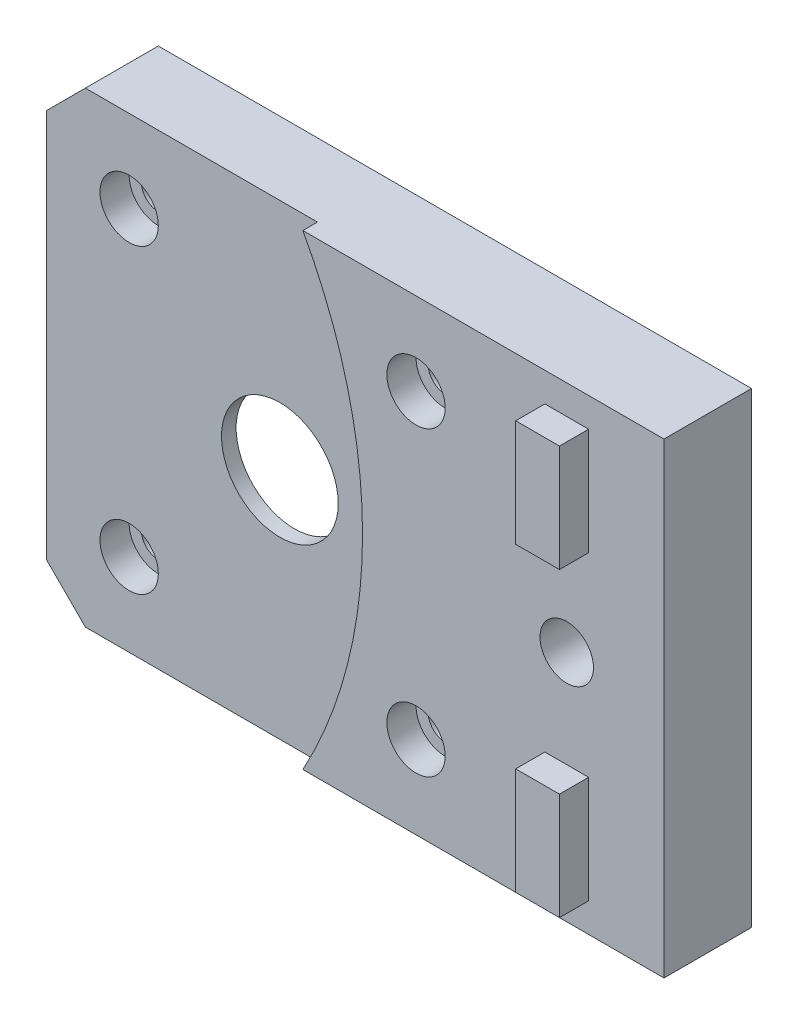
ISO-10303-21;
HEADER;
FILE_DESCRIPTION(('STEP AP214'),'2;1');
FILE_NAME('part.step','',(''),(''),'','','');
FILE_SCHEMA(('AUTOMOTIVE_DESIGN { 1 0 10303 214 1 1 1 1 }'));
ENDSEC;
DATA;
#1=APPLICATION_CONTEXT('core data for automotive mechanical design processes');
#2=APPLICATION_PROTOCOL_DEFINITION('international standard','automotive_design',2000,#1);
#3=PRODUCT_CONTEXT('',#1,'mechanical');
#4=PRODUCT('Part','Part','',(#3));
#5=PRODUCT_RELATED_PRODUCT_CATEGORY('part','',(#4));
#6=PRODUCT_DEFINITION_FORMATION('','',#4);
#7=PRODUCT_DEFINITION_CONTEXT('part definition',#1,'design');
#8=PRODUCT_DEFINITION('design','',#6,#7);
#9=PRODUCT_DEFINITION_SHAPE('','',#8);
#10=(LENGTH_UNIT() NAMED_UNIT(*) SI_UNIT(.MILLI.,.METRE.));
#11=(NAMED_UNIT(*) PLANE_ANGLE_UNIT() SI_UNIT($,.RADIAN.));
#12=(NAMED_UNIT(*) SI_UNIT($,.STERADIAN.) SOLID_ANGLE_UNIT());
#13=UNCERTAINTY_MEASURE_WITH_UNIT(LENGTH_MEASURE(1.E-05),#10,'distance_accuracy_value','');
#14=(GEOMETRIC_REPRESENTATION_CONTEXT(3) GLOBAL_UNCERTAINTY_ASSIGNED_CONTEXT((#13)) GLOBAL_UNIT_ASSIGNED_CONTEXT((#10,
#11,#12)) REPRESENTATION_CONTEXT('',''));
#15=CARTESIAN_POINT('',(0.,0.,0.));
#16=DIRECTION('',(0.,0.,1.));
#17=DIRECTION('',(1.,0.,0.));
#18=AXIS2_PLACEMENT_3D('',#15,#16,#17);
#19=CARTESIAN_POINT('',(-15.4997806436091,15.4997806436091,6.));
#20=DIRECTION('',(0.,0.,-1.));
#21=DIRECTION('',(-1.,0.,0.));
#22=AXIS2_PLACEMENT_3D('',#19,#20,#21);
#23=CYLINDRICAL_SURFACE('',#22,1.75);
#24=CARTESIAN_POINT('',(-15.4997806436091,15.4997806436091,0.));
#25=DIRECTION('',(0.,0.,1.));
#26=DIRECTION('',(1.,0.,0.));
#27=AXIS2_PLACEMENT_3D('',#24,#25,#26);
#28=CIRCLE('',#27,1.75);
#29=CARTESIAN_POINT('',(-13.7497806436091,15.4997806436091,0.));
#30=VERTEX_POINT('',#29);
#31=EDGE_CURVE('E392',#30,#30,#28,.F.);
#32=ORIENTED_EDGE('',*,*,#31,.T.);
#33=EDGE_LOOP('',(#32));
#34=FACE_BOUND('',#33,.T.);
#35=CARTESIAN_POINT('',(-15.4997806436091,15.4997806436091,1.5));
#36=DIRECTION('',(0.,0.,1.));
#37=DIRECTION('',(1.,0.,0.));
#38=AXIS2_PLACEMENT_3D('',#35,#36,#37);
#39=CIRCLE('',#38,1.75);
#40=CARTESIAN_POINT('',(-13.7497806436091,15.4997806436091,1.5));
#41=VERTEX_POINT('',#40);
#42=EDGE_CURVE('E45',#41,#41,#39,.T.);
#43=ORIENTED_EDGE('',*,*,#42,.T.);
#44=EDGE_LOOP('',(#43));
#45=FACE_BOUND('',#44,.T.);
#46=ADVANCED_FACE('F41',(#34,#45),#23,.F.);
#47=CARTESIAN_POINT('',(-15.4997806436091,-15.4997806436091,6.));
#48=DIRECTION('',(0.,0.,-1.));
#49=DIRECTION('',(-1.,0.,0.));
#50=AXIS2_PLACEMENT_3D('',#47,#48,#49);
#51=CYLINDRICAL_SURFACE('',#50,1.75);
#52=CARTESIAN_POINT('',(-15.4997806436091,-15.4997806436091,0.));
#53=DIRECTION('',(0.,0.,1.));
#54=DIRECTION('',(1.,0.,0.));
#55=AXIS2_PLACEMENT_3D('',#52,#53,#54);
#56=CIRCLE('',#55,1.75);
#57=CARTESIAN_POINT('',(-13.7497806436091,-15.4997806436091,0.));
#58=VERTEX_POINT('',#57);
#59=EDGE_CURVE('E396',#58,#58,#56,.F.);
#60=ORIENTED_EDGE('',*,*,#59,.T.);
#61=EDGE_LOOP('',(#60));
#62=FACE_BOUND('',#61,.T.);
#63=CARTESIAN_POINT('',(-15.4997806436091,-15.4997806436091,1.5));
#64=DIRECTION('',(0.,0.,1.));
#65=DIRECTION('',(1.,0.,0.));
#66=AXIS2_PLACEMENT_3D('',#63,#64,#65);
#67=CIRCLE('',#66,1.75);
#68=CARTESIAN_POINT('',(-13.7497806436091,-15.4997806436091,1.5));
#69=VERTEX_POINT('',#68);
#70=EDGE_CURVE('E440',#69,#69,#67,.T.);
#71=ORIENTED_EDGE('',*,*,#70,.T.);
#72=EDGE_LOOP('',(#71));
#73=FACE_BOUND('',#72,.T.);
#74=ADVANCED_FACE('F559',(#62,#73),#51,.F.);
#75=CARTESIAN_POINT('',(0.,0.,6.));
#76=DIRECTION('',(0.,0.,-1.));
#77=DIRECTION('',(-1.,0.,0.));
#78=AXIS2_PLACEMENT_3D('',#75,#76,#77);
#79=CYLINDRICAL_SURFACE('',#78,6.);
#80=CARTESIAN_POINT('',(0.,0.,3.));
#81=DIRECTION('',(0.,0.,1.));
#82=DIRECTION('',(1.,0.,0.));
#83=AXIS2_PLACEMENT_3D('',#80,#81,#82);
#84=CIRCLE('',#83,6.);
#85=CARTESIAN_POINT('',(6.,0.,3.));
#86=VERTEX_POINT('',#85);
#87=EDGE_CURVE('E348',#86,#86,#84,.F.);
#88=ORIENTED_EDGE('',*,*,#87,.T.);
#89=EDGE_LOOP('',(#88));
#90=FACE_BOUND('',#89,.T.);
#91=CARTESIAN_POINT('',(0.,0.,4.5));
#92=DIRECTION('',(0.,0.,1.));
#93=DIRECTION('',(1.,0.,0.));
#94=AXIS2_PLACEMENT_3D('',#91,#92,#93);
#95=CIRCLE('',#94,6.);
#96=CARTESIAN_POINT('',(6.,0.,4.5));
#97=VERTEX_POINT('',#96);
#98=EDGE_CURVE('E214',#97,#97,#95,.T.);
#99=ORIENTED_EDGE('',*,*,#98,.T.);
#100=EDGE_LOOP('',(#99));
#101=FACE_BOUND('',#100,.T.);
#102=ADVANCED_FACE('F565',(#90,#101),#79,.F.);
#103=CARTESIAN_POINT('',(-15.4997806436091,-15.4997806436091,3.));
#104=DIRECTION('',(0.,0.,1.));
#105=DIRECTION('',(1.,0.,0.));
#106=AXIS2_PLACEMENT_3D('',#103,#104,#105);
#107=CYLINDRICAL_SURFACE('',#106,3.);
#108=CARTESIAN_POINT('',(-15.4997806436091,-15.4997806436091,4.5));
#109=DIRECTION('',(0.,0.,1.));
#110=DIRECTION('',(1.,0.,0.));
#111=AXIS2_PLACEMENT_3D('',#108,#109,#110);
#112=CIRCLE('',#111,3.);
#113=CARTESIAN_POINT('',(-12.4997806436091,-15.4997806436091,4.5));
#114=VERTEX_POINT('',#113);
#115=EDGE_CURVE('E476',#114,#114,#112,.F.);
#116=ORIENTED_EDGE('',*,*,#115,.F.);
#117=EDGE_LOOP('',(#116));
#118=FACE_BOUND('',#117,.T.);
#119=CARTESIAN_POINT('',(-15.4997806436091,-15.4997806436091,1.5));
#120=DIRECTION('',(0.,0.,1.));
#121=DIRECTION('',(1.,0.,0.));
#122=AXIS2_PLACEMENT_3D('',#119,#120,#121);
#123=CIRCLE('',#122,3.);
#124=CARTESIAN_POINT('',(-12.4997806436091,-15.4997806436091,1.5));
#125=VERTEX_POINT('',#124);
#126=EDGE_CURVE('E450',#125,#125,#123,.T.);
#127=ORIENTED_EDGE('',*,*,#126,.F.);
#128=EDGE_LOOP('',(#127));
#129=FACE_BOUND('',#128,.T.);
#130=ADVANCED_FACE('F684',(#118,#129),#107,.F.);
#131=CARTESIAN_POINT('',(-15.4997806436091,15.4997806436091,3.));
#132=DIRECTION('',(0.,0.,1.));
#133=DIRECTION('',(1.,0.,0.));
#134=AXIS2_PLACEMENT_3D('',#131,#132,#133);
#135=CYLINDRICAL_SURFACE('',#134,3.);
#136=CARTESIAN_POINT('',(-15.4997806436091,15.4997806436091,4.5));
#137=DIRECTION('',(0.,0.,1.));
#138=DIRECTION('',(1.,0.,0.));
#139=AXIS2_PLACEMENT_3D('',#136,#137,#138);
#140=CIRCLE('',#139,3.);
#141=CARTESIAN_POINT('',(-12.4997806436091,15.4997806436091,4.5));
#142=VERTEX_POINT('',#141);
#143=EDGE_CURVE('E472',#142,#142,#140,.F.);
#144=ORIENTED_EDGE('',*,*,#143,.F.);
#145=EDGE_LOOP('',(#144));
#146=FACE_BOUND('',#145,.T.);
#147=CARTESIAN_POINT('',(-15.4997806436091,15.4997806436091,1.5));
#148=DIRECTION('',(0.,0.,1.));
#149=DIRECTION('',(1.,0.,0.));
#150=AXIS2_PLACEMENT_3D('',#147,#148,#149);
#151=CIRCLE('',#150,3.);
#152=CARTESIAN_POINT('',(-12.4997806436091,15.4997806436091,1.5));
#153=VERTEX_POINT('',#152);
#154=EDGE_CURVE('E443',#153,#153,#151,.T.);
#155=ORIENTED_EDGE('',*,*,#154,.F.);
#156=EDGE_LOOP('',(#155));
#157=FACE_BOUND('',#156,.T.);
#158=ADVANCED_FACE('F616',(#146,#157),#135,.F.);
#159=CARTESIAN_POINT('',(-24.,0.,6.));
#160=DIRECTION('',(-1.,0.,0.));
#161=DIRECTION('',(0.,0.,1.));
#162=AXIS2_PLACEMENT_3D('',#159,#160,#161);
#163=PLANE('',#162);
#164=DIRECTION('',(0.,0.,1.));
#165=VECTOR('',#164,1.);
#166=CARTESIAN_POINT('',(-24.,-20.,6.));
#167=LINE('',#166,#165);
#168=CARTESIAN_POINT('',(-24.,-20.,-3.));
#169=VERTEX_POINT('',#168);
#170=CARTESIAN_POINT('',(-24.,-20.,4.5));
#171=VERTEX_POINT('',#170);
#172=EDGE_CURVE('E432',#169,#171,#167,.T.);
#173=ORIENTED_EDGE('',*,*,#172,.T.);
#174=DIRECTION('',(0.,1.,0.));
#175=VECTOR('',#174,1.);
#176=CARTESIAN_POINT('',(-24.,0.,4.5));
#177=LINE('',#176,#175);
#178=CARTESIAN_POINT('',(-24.,20.,4.5));
#179=VERTEX_POINT('',#178);
#180=EDGE_CURVE('E459',#171,#179,#177,.T.);
#181=ORIENTED_EDGE('',*,*,#180,.T.);
#182=DIRECTION('',(0.,0.,-1.));
#183=VECTOR('',#182,1.);
#184=CARTESIAN_POINT('',(-24.,20.,6.));
#185=LINE('',#184,#183);
#186=CARTESIAN_POINT('',(-24.,20.,-3.));
#187=VERTEX_POINT('',#186);
#188=EDGE_CURVE('E67',#179,#187,#185,.T.);
#189=ORIENTED_EDGE('',*,*,#188,.T.);
#190=DIRECTION('',(0.,1.,0.));
#191=VECTOR('',#190,1.);
#192=CARTESIAN_POINT('',(-24.,0.,-3.));
#193=LINE('',#192,#191);
#194=EDGE_CURVE('E492',#169,#187,#193,.T.);
#195=ORIENTED_EDGE('',*,*,#194,.F.);
#196=EDGE_LOOP('',(#173,#181,#189,#195));
#197=FACE_BOUND('',#196,.T.);
#198=ADVANCED_FACE('F609',(#197),#163,.T.);
#199=CARTESIAN_POINT('',(-20.,-24.,6.));
#200=DIRECTION('',(-0.707106781186549,-0.707106781186546,0.));
#201=DIRECTION('',(0.,0.,1.));
#202=AXIS2_PLACEMENT_3D('',#199,#200,#201);
#203=PLANE('',#202);
#204=DIRECTION('',(0.,0.,-1.));
#205=VECTOR('',#204,1.);
#206=CARTESIAN_POINT('',(-20.,-24.,-3.));
#207=LINE('',#206,#205);
#208=CARTESIAN_POINT('',(-20.,-24.,4.5));
#209=VERTEX_POINT('',#208);
#210=CARTESIAN_POINT('',(-20.,-24.,-3.));
#211=VERTEX_POINT('',#210);
#212=EDGE_CURVE('E421',#209,#211,#207,.T.);
#213=ORIENTED_EDGE('',*,*,#212,.F.);
#214=DIRECTION('',(-0.707106781186546,0.707106781186549,0.));
#215=VECTOR('',#214,1.);
#216=CARTESIAN_POINT('',(-20.,-24.,4.5));
#217=LINE('',#216,#215);
#218=EDGE_CURVE('E465',#209,#171,#217,.T.);
#219=ORIENTED_EDGE('',*,*,#218,.T.);
#220=ORIENTED_EDGE('',*,*,#172,.F.);
#221=DIRECTION('',(-0.707106781186546,0.707106781186549,0.));
#222=VECTOR('',#221,1.);
#223=CARTESIAN_POINT('',(-22.,-21.9999999999999,-3.));
#224=LINE('',#223,#222);
#225=EDGE_CURVE('E427',#211,#169,#224,.T.);
#226=ORIENTED_EDGE('',*,*,#225,.F.);
#227=EDGE_LOOP('',(#213,#219,#220,#226));
#228=FACE_BOUND('',#227,.T.);
#229=ADVANCED_FACE('F607',(#228),#203,.T.);
#230=CARTESIAN_POINT('',(-24.,20.,6.));
#231=DIRECTION('',(0.707106781186546,-0.707106781186549,0.));
#232=DIRECTION('',(0.,0.,-1.));
#233=AXIS2_PLACEMENT_3D('',#230,#231,#232);
#234=PLANE('',#233);
#235=ORIENTED_EDGE('',*,*,#188,.F.);
#236=DIRECTION('',(-0.707106781186549,-0.707106781186546,0.));
#237=VECTOR('',#236,1.);
#238=CARTESIAN_POINT('',(-24.,20.,4.5));
#239=LINE('',#238,#237);
#240=CARTESIAN_POINT('',(-20.,24.,4.5));
#241=VERTEX_POINT('',#240);
#242=EDGE_CURVE('E51',#179,#241,#239,.F.);
#243=ORIENTED_EDGE('',*,*,#242,.T.);
#244=DIRECTION('',(0.,0.,1.));
#245=VECTOR('',#244,1.);
#246=CARTESIAN_POINT('',(-20.,24.,6.));
#247=LINE('',#246,#245);
#248=CARTESIAN_POINT('',(-20.,24.,-3.));
#249=VERTEX_POINT('',#248);
#250=EDGE_CURVE('E436',#249,#241,#247,.T.);
#251=ORIENTED_EDGE('',*,*,#250,.F.);
#252=DIRECTION('',(-0.707106781186549,-0.707106781186546,0.));
#253=VECTOR('',#252,1.);
#254=CARTESIAN_POINT('',(-22.,22.,-3.));
#255=LINE('',#254,#253);
#256=EDGE_CURVE('E424',#187,#249,#255,.F.);
#257=ORIENTED_EDGE('',*,*,#256,.F.);
#258=EDGE_LOOP('',(#235,#243,#251,#257));
#259=FACE_BOUND('',#258,.T.);
#260=ADVANCED_FACE('F43',(#259),#234,.F.);
#261=CARTESIAN_POINT('',(0.,21.,6.));
#262=DIRECTION('',(0.,1.,0.));
#263=DIRECTION('',(0.,0.,1.));
#264=AXIS2_PLACEMENT_3D('',#261,#262,#263);
#265=PLANE('',#264);
#266=DIRECTION('',(0.,0.,-1.));
#267=VECTOR('',#266,1.);
#268=CARTESIAN_POINT('',(33.25,21.,9.));
#269=LINE('',#268,#267);
#270=CARTESIAN_POINT('',(33.25,21.,9.));
#271=VERTEX_POINT('',#270);
#272=CARTESIAN_POINT('',(33.25,21.,6.));
#273=VERTEX_POINT('',#272);
#274=EDGE_CURVE('E325',#271,#273,#269,.T.);
#275=ORIENTED_EDGE('',*,*,#274,.T.);
#276=DIRECTION('',(-1.,0.,0.));
#277=VECTOR('',#276,1.);
#278=CARTESIAN_POINT('',(0.,21.,6.));
#279=LINE('',#278,#277);
#280=CARTESIAN_POINT('',(28.75,21.,6.));
#281=VERTEX_POINT('',#280);
#282=EDGE_CURVE('E261',#273,#281,#279,.T.);
#283=ORIENTED_EDGE('',*,*,#282,.T.);
#284=DIRECTION('',(0.,0.,-1.));
#285=VECTOR('',#284,1.);
#286=CARTESIAN_POINT('',(28.75,21.,9.));
#287=LINE('',#286,#285);
#288=CARTESIAN_POINT('',(28.75,21.,9.));
#289=VERTEX_POINT('',#288);
#290=EDGE_CURVE('E312',#289,#281,#287,.T.);
#291=ORIENTED_EDGE('',*,*,#290,.F.);
#292=DIRECTION('',(-1.,0.,0.));
#293=VECTOR('',#292,1.);
#294=CARTESIAN_POINT('',(33.25,21.,9.));
#295=LINE('',#294,#293);
#296=EDGE_CURVE('E309',#271,#289,#295,.T.);
#297=ORIENTED_EDGE('',*,*,#296,.F.);
#298=EDGE_LOOP('',(#275,#283,#291,#297));
#299=FACE_BOUND('',#298,.T.);
#300=ADVANCED_FACE('F600',(#299),#265,.T.);
#301=CARTESIAN_POINT('',(0.,-21.,6.));
#302=DIRECTION('',(0.,1.,0.));
#303=DIRECTION('',(0.,0.,1.));
#304=AXIS2_PLACEMENT_3D('',#301,#302,#303);
#305=PLANE('',#304);
#306=DIRECTION('',(-1.,0.,0.));
#307=VECTOR('',#306,1.);
#308=CARTESIAN_POINT('',(0.,-21.,6.));
#309=LINE('',#308,#307);
#310=CARTESIAN_POINT('',(33.25,-21.,6.));
#311=VERTEX_POINT('',#310);
#312=CARTESIAN_POINT('',(28.75,-21.,6.));
#313=VERTEX_POINT('',#312);
#314=EDGE_CURVE('E237',#311,#313,#309,.T.);
#315=ORIENTED_EDGE('',*,*,#314,.F.);
#316=DIRECTION('',(0.,0.,-1.));
#317=VECTOR('',#316,1.);
#318=CARTESIAN_POINT('',(33.25,-21.,9.));
#319=LINE('',#318,#317);
#320=CARTESIAN_POINT('',(33.25,-21.,9.));
#321=VERTEX_POINT('',#320);
#322=EDGE_CURVE('E329',#321,#311,#319,.T.);
#323=ORIENTED_EDGE('',*,*,#322,.F.);
#324=DIRECTION('',(1.,0.,0.));
#325=VECTOR('',#324,1.);
#326=CARTESIAN_POINT('',(33.25,-21.,9.));
#327=LINE('',#326,#325);
#328=CARTESIAN_POINT('',(28.75,-21.,9.));
#329=VERTEX_POINT('',#328);
#330=EDGE_CURVE('E300',#329,#321,#327,.T.);
#331=ORIENTED_EDGE('',*,*,#330,.F.);
#332=DIRECTION('',(0.,0.,-1.));
#333=VECTOR('',#332,1.);
#334=CARTESIAN_POINT('',(28.75,-21.,9.));
#335=LINE('',#334,#333);
#336=EDGE_CURVE('E333',#329,#313,#335,.T.);
#337=ORIENTED_EDGE('',*,*,#336,.T.);
#338=EDGE_LOOP('',(#315,#323,#331,#337));
#339=FACE_BOUND('',#338,.T.);
#340=ADVANCED_FACE('F597',(#339),#305,.F.);
#341=CARTESIAN_POINT('',(0.,0.,0.));
#342=DIRECTION('',(0.,0.,1.));
#343=DIRECTION('',(1.,0.,0.));
#344=AXIS2_PLACEMENT_3D('',#341,#342,#343);
#345=PLANE('',#344);
#346=CARTESIAN_POINT('',(31.,0.,0.));
#347=DIRECTION('',(0.,0.,1.));
#348=DIRECTION('',(1.,0.,0.));
#349=AXIS2_PLACEMENT_3D('',#346,#347,#348);
#350=CIRCLE('',#349,2.75);
#351=CARTESIAN_POINT('',(33.75,0.,0.));
#352=VERTEX_POINT('',#351);
#353=EDGE_CURVE('E291',#352,#352,#350,.T.);
#354=ORIENTED_EDGE('',*,*,#353,.T.);
#355=EDGE_LOOP('',(#354));
#356=FACE_BOUND('',#355,.T.);
#357=CARTESIAN_POINT('',(31.,0.,0.));
#358=DIRECTION('',(0.,0.,1.));
#359=DIRECTION('',(1.,0.,0.));
#360=AXIS2_PLACEMENT_3D('',#357,#358,#359);
#361=CIRCLE('',#360,7.);
#362=CARTESIAN_POINT('',(38.,0.,0.));
#363=VERTEX_POINT('',#362);
#364=EDGE_CURVE('E413',#363,#363,#361,.T.);
#365=ORIENTED_EDGE('',*,*,#364,.F.);
#366=EDGE_LOOP('',(#365));
#367=FACE_BOUND('',#366,.T.);
#368=ADVANCED_FACE('F596',(#356,#367),#345,.F.);
#369=CARTESIAN_POINT('',(28.75,-21.,9.));
#370=DIRECTION('',(1.,0.,0.));
#371=DIRECTION('',(0.,0.,-1.));
#372=AXIS2_PLACEMENT_3D('',#369,#370,#371);
#373=PLANE('',#372);
#374=DIRECTION('',(0.,0.,1.));
#375=VECTOR('',#374,1.);
#376=CARTESIAN_POINT('',(28.75,-10.,9.));
#377=LINE('',#376,#375);
#378=CARTESIAN_POINT('',(28.75,-10.,6.));
#379=VERTEX_POINT('',#378);
#380=CARTESIAN_POINT('',(28.75,-10.,9.));
#381=VERTEX_POINT('',#380);
#382=EDGE_CURVE('E281',#379,#381,#377,.T.);
#383=ORIENTED_EDGE('',*,*,#382,.F.);
#384=DIRECTION('',(0.,-1.,0.));
#385=VECTOR('',#384,1.);
#386=CARTESIAN_POINT('',(28.75,-21.,6.));
#387=LINE('',#386,#385);
#388=EDGE_CURVE('E295',#379,#313,#387,.T.);
#389=ORIENTED_EDGE('',*,*,#388,.T.);
#390=ORIENTED_EDGE('',*,*,#336,.F.);
#391=DIRECTION('',(0.,-1.,0.));
#392=VECTOR('',#391,1.);
#393=CARTESIAN_POINT('',(28.75,-21.,9.));
#394=LINE('',#393,#392);
#395=EDGE_CURVE('E301',#381,#329,#394,.T.);
#396=ORIENTED_EDGE('',*,*,#395,.F.);
#397=EDGE_LOOP('',(#383,#389,#390,#396));
#398=FACE_BOUND('',#397,.T.);
#399=ADVANCED_FACE('F676',(#398),#373,.F.);
#400=CARTESIAN_POINT('',(33.25,-21.,9.));
#401=DIRECTION('',(-1.,0.,0.));
#402=DIRECTION('',(0.,0.,1.));
#403=AXIS2_PLACEMENT_3D('',#400,#401,#402);
#404=PLANE('',#403);
#405=DIRECTION('',(0.,0.,1.));
#406=VECTOR('',#405,1.);
#407=CARTESIAN_POINT('',(33.25,9.99999999999999,9.));
#408=LINE('',#407,#406);
#409=CARTESIAN_POINT('',(33.25,10.,6.));
#410=VERTEX_POINT('',#409);
#411=CARTESIAN_POINT('',(33.25,10.,9.));
#412=VERTEX_POINT('',#411);
#413=EDGE_CURVE('E284',#410,#412,#408,.T.);
#414=ORIENTED_EDGE('',*,*,#413,.F.);
#415=DIRECTION('',(0.,1.,0.));
#416=VECTOR('',#415,1.);
#417=CARTESIAN_POINT('',(33.25,-21.,6.));
#418=LINE('',#417,#416);
#419=EDGE_CURVE('E317',#410,#273,#418,.T.);
#420=ORIENTED_EDGE('',*,*,#419,.T.);
#421=ORIENTED_EDGE('',*,*,#274,.F.);
#422=DIRECTION('',(0.,1.,0.));
#423=VECTOR('',#422,1.);
#424=CARTESIAN_POINT('',(33.25,-21.,9.));
#425=LINE('',#424,#423);
#426=EDGE_CURVE('E304',#412,#271,#425,.T.);
#427=ORIENTED_EDGE('',*,*,#426,.F.);
#428=EDGE_LOOP('',(#414,#420,#421,#427));
#429=FACE_BOUND('',#428,.T.);
#430=ADVANCED_FACE('F672',(#429),#404,.F.);
#431=CARTESIAN_POINT('',(0.,0.,9.));
#432=DIRECTION('',(0.,0.,1.));
#433=DIRECTION('',(1.,0.,0.));
#434=AXIS2_PLACEMENT_3D('',#431,#432,#433);
#435=PLANE('',#434);
#436=CARTESIAN_POINT('',(28.75,9.99999999999999,9.));
#437=VERTEX_POINT('',#436);
#438=EDGE_CURVE('E296',#289,#437,#394,.T.);
#439=ORIENTED_EDGE('',*,*,#438,.T.);
#440=DIRECTION('',(-1.,0.,0.));
#441=VECTOR('',#440,1.);
#442=CARTESIAN_POINT('',(35.7282177914324,10.,9.));
#443=LINE('',#442,#441);
#444=EDGE_CURVE('E268',#412,#437,#443,.T.);
#445=ORIENTED_EDGE('',*,*,#444,.F.);
#446=ORIENTED_EDGE('',*,*,#426,.T.);
#447=ORIENTED_EDGE('',*,*,#296,.T.);
#448=EDGE_LOOP('',(#439,#445,#446,#447));
#449=FACE_BOUND('',#448,.T.);
#450=ADVANCED_FACE('F668',(#449),#435,.T.);
#451=DIRECTION('',(0.,0.,-1.));
#452=VECTOR('',#451,1.);
#453=CARTESIAN_POINT('',(28.75,9.99999999999999,9.));
#454=LINE('',#453,#452);
#455=CARTESIAN_POINT('',(28.75,9.99999999999999,6.));
#456=VERTEX_POINT('',#455);
#457=EDGE_CURVE('E410',#437,#456,#454,.T.);
#458=ORIENTED_EDGE('',*,*,#457,.F.);
#459=ORIENTED_EDGE('',*,*,#438,.F.);
#460=ORIENTED_EDGE('',*,*,#290,.T.);
#461=EDGE_CURVE('E313',#281,#456,#387,.T.);
#462=ORIENTED_EDGE('',*,*,#461,.T.);
#463=EDGE_LOOP('',(#458,#459,#460,#462));
#464=FACE_BOUND('',#463,.T.);
#465=ADVANCED_FACE('F671',(#464),#373,.F.);
#466=DIRECTION('',(0.,0.,-1.));
#467=VECTOR('',#466,1.);
#468=CARTESIAN_POINT('',(33.25,-10.,9.));
#469=LINE('',#468,#467);
#470=CARTESIAN_POINT('',(33.25,-10.,9.));
#471=VERTEX_POINT('',#470);
#472=CARTESIAN_POINT('',(33.25,-10.,6.));
#473=VERTEX_POINT('',#472);
#474=EDGE_CURVE('E272',#471,#473,#469,.T.);
#475=ORIENTED_EDGE('',*,*,#474,.F.);
#476=EDGE_CURVE('E305',#321,#471,#425,.T.);
#477=ORIENTED_EDGE('',*,*,#476,.F.);
#478=ORIENTED_EDGE('',*,*,#322,.T.);
#479=EDGE_CURVE('E318',#311,#473,#418,.T.);
#480=ORIENTED_EDGE('',*,*,#479,.T.);
#481=EDGE_LOOP('',(#475,#477,#478,#480));
#482=FACE_BOUND('',#481,.T.);
#483=ADVANCED_FACE('F678',(#482),#404,.F.);
#484=ORIENTED_EDGE('',*,*,#476,.T.);
#485=DIRECTION('',(1.,0.,0.));
#486=VECTOR('',#485,1.);
#487=CARTESIAN_POINT('',(35.7282177914324,-10.,9.));
#488=LINE('',#487,#486);
#489=EDGE_CURVE('E265',#381,#471,#488,.T.);
#490=ORIENTED_EDGE('',*,*,#489,.F.);
#491=ORIENTED_EDGE('',*,*,#395,.T.);
#492=ORIENTED_EDGE('',*,*,#330,.T.);
#493=EDGE_LOOP('',(#484,#490,#491,#492));
#494=FACE_BOUND('',#493,.T.);
#495=ADVANCED_FACE('F666',(#494),#435,.T.);
#496=CARTESIAN_POINT('',(31.,0.,9.));
#497=DIRECTION('',(0.,0.,-1.));
#498=DIRECTION('',(-1.,0.,0.));
#499=AXIS2_PLACEMENT_3D('',#496,#497,#498);
#500=CYLINDRICAL_SURFACE('',#499,2.75);
#501=ORIENTED_EDGE('',*,*,#353,.F.);
#502=EDGE_LOOP('',(#501));
#503=FACE_BOUND('',#502,.T.);
#504=CARTESIAN_POINT('',(31.,0.,6.));
#505=DIRECTION('',(0.,0.,1.));
#506=DIRECTION('',(1.,0.,0.));
#507=AXIS2_PLACEMENT_3D('',#504,#505,#506);
#508=CIRCLE('',#507,2.75);
#509=CARTESIAN_POINT('',(33.75,0.,6.));
#510=VERTEX_POINT('',#509);
#511=EDGE_CURVE('E287',#510,#510,#508,.T.);
#512=ORIENTED_EDGE('',*,*,#511,.T.);
#513=EDGE_LOOP('',(#512));
#514=FACE_BOUND('',#513,.T.);
#515=ADVANCED_FACE('F580',(#503,#514),#500,.F.);
#516=CARTESIAN_POINT('',(15.4997806436091,15.4997806436091,6.));
#517=DIRECTION('',(0.,0.,-1.));
#518=DIRECTION('',(-1.,0.,0.));
#519=AXIS2_PLACEMENT_3D('',#516,#517,#518);
#520=CYLINDRICAL_SURFACE('',#519,1.75);
#521=CARTESIAN_POINT('',(15.4997806436091,15.4997806436091,0.));
#522=DIRECTION('',(0.,0.,1.));
#523=DIRECTION('',(1.,0.,0.));
#524=AXIS2_PLACEMENT_3D('',#521,#522,#523);
#525=CIRCLE('',#524,1.75);
#526=CARTESIAN_POINT('',(17.2497806436091,15.4997806436091,0.));
#527=VERTEX_POINT('',#526);
#528=EDGE_CURVE('E388',#527,#527,#525,.F.);
#529=ORIENTED_EDGE('',*,*,#528,.T.);
#530=EDGE_LOOP('',(#529));
#531=FACE_BOUND('',#530,.T.);
#532=CARTESIAN_POINT('',(15.4997806436091,15.4997806436091,3.));
#533=DIRECTION('',(0.,0.,1.));
#534=DIRECTION('',(1.,0.,0.));
#535=AXIS2_PLACEMENT_3D('',#532,#533,#534);
#536=CIRCLE('',#535,1.75);
#537=CARTESIAN_POINT('',(17.2497806436091,15.4997806436091,3.));
#538=VERTEX_POINT('',#537);
#539=EDGE_CURVE('E338',#538,#538,#536,.T.);
#540=ORIENTED_EDGE('',*,*,#539,.T.);
#541=EDGE_LOOP('',(#540));
#542=FACE_BOUND('',#541,.T.);
#543=ADVANCED_FACE('F576',(#531,#542),#520,.F.);
#544=CARTESIAN_POINT('',(15.4997806436091,-15.4997806436091,6.));
#545=DIRECTION('',(0.,0.,-1.));
#546=DIRECTION('',(-1.,0.,0.));
#547=AXIS2_PLACEMENT_3D('',#544,#545,#546);
#548=CYLINDRICAL_SURFACE('',#547,1.75);
#549=CARTESIAN_POINT('',(15.4997806436091,-15.4997806436091,0.));
#550=DIRECTION('',(0.,0.,1.));
#551=DIRECTION('',(1.,0.,0.));
#552=AXIS2_PLACEMENT_3D('',#549,#550,#551);
#553=CIRCLE('',#552,1.75);
#554=CARTESIAN_POINT('',(17.2497806436091,-15.4997806436091,0.));
#555=VERTEX_POINT('',#554);
#556=EDGE_CURVE('E371',#555,#555,#553,.F.);
#557=ORIENTED_EDGE('',*,*,#556,.T.);
#558=EDGE_LOOP('',(#557));
#559=FACE_BOUND('',#558,.T.);
#560=CARTESIAN_POINT('',(15.4997806436091,-15.4997806436091,3.));
#561=DIRECTION('',(0.,0.,1.));
#562=DIRECTION('',(1.,0.,0.));
#563=AXIS2_PLACEMENT_3D('',#560,#561,#562);
#564=CIRCLE('',#563,1.75);
#565=CARTESIAN_POINT('',(17.2497806436091,-15.4997806436091,3.));
#566=VERTEX_POINT('',#565);
#567=EDGE_CURVE('E337',#566,#566,#564,.T.);
#568=ORIENTED_EDGE('',*,*,#567,.T.);
#569=EDGE_LOOP('',(#568));
#570=FACE_BOUND('',#569,.T.);
#571=ADVANCED_FACE('F572',(#559,#570),#548,.F.);
#572=CARTESIAN_POINT('',(41.,0.,6.));
#573=DIRECTION('',(1.,0.,0.));
#574=DIRECTION('',(0.,1.,0.));
#575=AXIS2_PLACEMENT_3D('',#572,#573,#574);
#576=PLANE('',#575);
#577=DIRECTION('',(0.,-1.,0.));
#578=VECTOR('',#577,1.);
#579=CARTESIAN_POINT('',(41.,0.,6.));
#580=LINE('',#579,#578);
#581=CARTESIAN_POINT('',(41.,24.,6.));
#582=VERTEX_POINT('',#581);
#583=CARTESIAN_POINT('',(41.,-24.,6.));
#584=VERTEX_POINT('',#583);
#585=EDGE_CURVE('E219',#582,#584,#580,.T.);
#586=ORIENTED_EDGE('',*,*,#585,.T.);
#587=DIRECTION('',(0.,0.,-1.));
#588=VECTOR('',#587,1.);
#589=CARTESIAN_POINT('',(41.,-24.,6.));
#590=LINE('',#589,#588);
#591=CARTESIAN_POINT('',(41.,-24.,-3.));
#592=VERTEX_POINT('',#591);
#593=EDGE_CURVE('E253',#584,#592,#590,.T.);
#594=ORIENTED_EDGE('',*,*,#593,.T.);
#595=DIRECTION('',(0.,1.,0.));
#596=VECTOR('',#595,1.);
#597=CARTESIAN_POINT('',(41.,0.,-3.));
#598=LINE('',#597,#596);
#599=CARTESIAN_POINT('',(41.,24.,-3.));
#600=VERTEX_POINT('',#599);
#601=EDGE_CURVE('E485',#592,#600,#598,.T.);
#602=ORIENTED_EDGE('',*,*,#601,.T.);
#603=DIRECTION('',(0.,0.,-1.));
#604=VECTOR('',#603,1.);
#605=CARTESIAN_POINT('',(41.,24.,6.));
#606=LINE('',#605,#604);
#607=EDGE_CURVE('E227',#582,#600,#606,.T.);
#608=ORIENTED_EDGE('',*,*,#607,.F.);
#609=EDGE_LOOP('',(#586,#594,#602,#608));
#610=FACE_BOUND('',#609,.T.);
#611=ADVANCED_FACE('F575',(#610),#576,.T.);
#612=CARTESIAN_POINT('',(0.,0.,6.));
#613=DIRECTION('',(0.,0.,1.));
#614=DIRECTION('',(1.,0.,0.));
#615=AXIS2_PLACEMENT_3D('',#612,#613,#614);
#616=PLANE('',#615);
#617=CARTESIAN_POINT('',(-40.,0.,6.));
#618=DIRECTION('',(0.,0.,1.));
#619=DIRECTION('',(1.,0.,0.));
#620=AXIS2_PLACEMENT_3D('',#617,#618,#619);
#621=CIRCLE('',#620,50.);
#622=CARTESIAN_POINT('',(3.86342439892263,-24.,6.));
#623=VERTEX_POINT('',#622);
#624=CARTESIAN_POINT('',(3.86342439892263,24.,6.));
#625=VERTEX_POINT('',#624);
#626=EDGE_CURVE('E195',#623,#625,#621,.T.);
#627=ORIENTED_EDGE('',*,*,#626,.F.);
#628=DIRECTION('',(1.,0.,0.));
#629=VECTOR('',#628,1.);
#630=CARTESIAN_POINT('',(0.,-24.,6.));
#631=LINE('',#630,#629);
#632=EDGE_CURVE('E222',#623,#584,#631,.T.);
#633=ORIENTED_EDGE('',*,*,#632,.T.);
#634=ORIENTED_EDGE('',*,*,#585,.F.);
#635=DIRECTION('',(1.,0.,0.));
#636=VECTOR('',#635,1.);
#637=CARTESIAN_POINT('',(0.,24.,6.));
#638=LINE('',#637,#636);
#639=EDGE_CURVE('E209',#625,#582,#638,.T.);
#640=ORIENTED_EDGE('',*,*,#639,.F.);
#641=EDGE_LOOP('',(#627,#633,#634,#640));
#642=FACE_BOUND('',#641,.T.);
#643=ORIENTED_EDGE('',*,*,#282,.F.);
#644=ORIENTED_EDGE('',*,*,#419,.F.);
#645=DIRECTION('',(-1.,0.,0.));
#646=VECTOR('',#645,1.);
#647=CARTESIAN_POINT('',(35.7282177914324,10.,6.));
#648=LINE('',#647,#646);
#649=EDGE_CURVE('E269',#410,#456,#648,.T.);
#650=ORIENTED_EDGE('',*,*,#649,.T.);
#651=ORIENTED_EDGE('',*,*,#461,.F.);
#652=EDGE_LOOP('',(#643,#644,#650,#651));
#653=FACE_BOUND('',#652,.T.);
#654=ORIENTED_EDGE('',*,*,#314,.T.);
#655=ORIENTED_EDGE('',*,*,#388,.F.);
#656=DIRECTION('',(1.,0.,0.));
#657=VECTOR('',#656,1.);
#658=CARTESIAN_POINT('',(35.7282177914324,-10.,6.));
#659=LINE('',#658,#657);
#660=EDGE_CURVE('E264',#379,#473,#659,.T.);
#661=ORIENTED_EDGE('',*,*,#660,.T.);
#662=ORIENTED_EDGE('',*,*,#479,.F.);
#663=EDGE_LOOP('',(#654,#655,#661,#662));
#664=FACE_BOUND('',#663,.T.);
#665=CARTESIAN_POINT('',(15.4997806436091,-15.4997806436091,6.));
#666=DIRECTION('',(0.,0.,1.));
#667=DIRECTION('',(1.,0.,0.));
#668=AXIS2_PLACEMENT_3D('',#665,#666,#667);
#669=CIRCLE('',#668,3.);
#670=CARTESIAN_POINT('',(18.4997806436091,-15.4997806436091,6.));
#671=VERTEX_POINT('',#670);
#672=EDGE_CURVE('E355',#671,#671,#669,.T.);
#673=ORIENTED_EDGE('',*,*,#672,.F.);
#674=EDGE_LOOP('',(#673));
#675=FACE_BOUND('',#674,.T.);
#676=CARTESIAN_POINT('',(15.4997806436091,15.4997806436091,6.));
#677=DIRECTION('',(0.,0.,1.));
#678=DIRECTION('',(1.,0.,0.));
#679=AXIS2_PLACEMENT_3D('',#676,#677,#678);
#680=CIRCLE('',#679,3.);
#681=CARTESIAN_POINT('',(18.4997806436091,15.4997806436091,6.));
#682=VERTEX_POINT('',#681);
#683=EDGE_CURVE('E342',#682,#682,#680,.T.);
#684=ORIENTED_EDGE('',*,*,#683,.F.);
#685=EDGE_LOOP('',(#684));
#686=FACE_BOUND('',#685,.T.);
#687=ORIENTED_EDGE('',*,*,#511,.F.);
#688=EDGE_LOOP('',(#687));
#689=FACE_BOUND('',#688,.T.);
#690=ADVANCED_FACE('F216',(#642,#653,#664,#675,#686,#689),#616,.T.);
#691=ORIENTED_EDGE('',*,*,#556,.F.);
#692=EDGE_LOOP('',(#691));
#693=FACE_BOUND('',#692,.T.);
#694=ORIENTED_EDGE('',*,*,#59,.F.);
#695=EDGE_LOOP('',(#694));
#696=FACE_BOUND('',#695,.T.);
#697=ORIENTED_EDGE('',*,*,#31,.F.);
#698=EDGE_LOOP('',(#697));
#699=FACE_BOUND('',#698,.T.);
#700=ORIENTED_EDGE('',*,*,#528,.F.);
#701=EDGE_LOOP('',(#700));
#702=FACE_BOUND('',#701,.T.);
#703=CARTESIAN_POINT('',(0.,0.,0.));
#704=DIRECTION('',(0.,0.,1.));
#705=DIRECTION('',(1.,0.,0.));
#706=AXIS2_PLACEMENT_3D('',#703,#704,#705);
#707=CIRCLE('',#706,11.25);
#708=CARTESIAN_POINT('',(11.25,0.,0.));
#709=VERTEX_POINT('',#708);
#710=EDGE_CURVE('E367',#709,#709,#707,.T.);
#711=ORIENTED_EDGE('',*,*,#710,.T.);
#712=EDGE_LOOP('',(#711));
#713=FACE_BOUND('',#712,.T.);
#714=DIRECTION('',(1.,0.,0.));
#715=VECTOR('',#714,1.);
#716=CARTESIAN_POINT('',(0.,21.,0.));
#717=LINE('',#716,#715);
#718=CARTESIAN_POINT('',(-18.,21.,0.));
#719=VERTEX_POINT('',#718);
#720=CARTESIAN_POINT('',(21.,21.,0.));
#721=VERTEX_POINT('',#720);
#722=EDGE_CURVE('E366',#719,#721,#717,.T.);
#723=ORIENTED_EDGE('',*,*,#722,.T.);
#724=DIRECTION('',(0.,-1.,0.));
#725=VECTOR('',#724,1.);
#726=CARTESIAN_POINT('',(21.,0.,0.));
#727=LINE('',#726,#725);
#728=CARTESIAN_POINT('',(21.,-21.,0.));
#729=VERTEX_POINT('',#728);
#730=EDGE_CURVE('E417',#721,#729,#727,.T.);
#731=ORIENTED_EDGE('',*,*,#730,.T.);
#732=DIRECTION('',(1.,0.,0.));
#733=VECTOR('',#732,1.);
#734=CARTESIAN_POINT('',(0.,-21.,0.));
#735=LINE('',#734,#733);
#736=CARTESIAN_POINT('',(-18.,-21.,0.));
#737=VERTEX_POINT('',#736);
#738=EDGE_CURVE('E375',#737,#729,#735,.T.);
#739=ORIENTED_EDGE('',*,*,#738,.F.);
#740=DIRECTION('',(-0.707106781186546,0.707106781186549,0.));
#741=VECTOR('',#740,1.);
#742=CARTESIAN_POINT('',(-18.,-21.,0.));
#743=LINE('',#742,#741);
#744=CARTESIAN_POINT('',(-21.,-18.,0.));
#745=VERTEX_POINT('',#744);
#746=EDGE_CURVE('E374',#737,#745,#743,.T.);
#747=ORIENTED_EDGE('',*,*,#746,.T.);
#748=DIRECTION('',(0.,1.,0.));
#749=VECTOR('',#748,1.);
#750=CARTESIAN_POINT('',(-21.,0.,0.));
#751=LINE('',#750,#749);
#752=CARTESIAN_POINT('',(-21.,18.,0.));
#753=VERTEX_POINT('',#752);
#754=EDGE_CURVE('E379',#745,#753,#751,.T.);
#755=ORIENTED_EDGE('',*,*,#754,.T.);
#756=DIRECTION('',(-0.707106781186548,-0.707106781186547,0.));
#757=VECTOR('',#756,1.);
#758=CARTESIAN_POINT('',(-21.,18.,0.));
#759=LINE('',#758,#757);
#760=EDGE_CURVE('E406',#753,#719,#759,.F.);
#761=ORIENTED_EDGE('',*,*,#760,.T.);
#762=EDGE_LOOP('',(#723,#731,#739,#747,#755,#761));
#763=FACE_BOUND('',#762,.T.);
#764=ADVANCED_FACE('F535',(#693,#696,#699,#702,#713,#763),#345,.F.);
#765=CARTESIAN_POINT('',(0.,0.,3.));
#766=DIRECTION('',(0.,0.,-1.));
#767=DIRECTION('',(-1.,0.,0.));
#768=AXIS2_PLACEMENT_3D('',#765,#766,#767);
#769=CYLINDRICAL_SURFACE('',#768,11.25);
#770=CARTESIAN_POINT('',(0.,0.,3.));
#771=DIRECTION('',(0.,0.,1.));
#772=DIRECTION('',(1.,0.,0.));
#773=AXIS2_PLACEMENT_3D('',#770,#771,#772);
#774=CIRCLE('',#773,11.25);
#775=CARTESIAN_POINT('',(11.25,0.,3.));
#776=VERTEX_POINT('',#775);
#777=EDGE_CURVE('E362',#776,#776,#774,.T.);
#778=ORIENTED_EDGE('',*,*,#777,.T.);
#779=EDGE_LOOP('',(#778));
#780=FACE_BOUND('',#779,.T.);
#781=ORIENTED_EDGE('',*,*,#710,.F.);
#782=EDGE_LOOP('',(#781));
#783=FACE_BOUND('',#782,.T.);
#784=ADVANCED_FACE('F586',(#780,#783),#769,.F.);
#785=CARTESIAN_POINT('',(0.,0.,3.));
#786=DIRECTION('',(0.,0.,1.));
#787=DIRECTION('',(1.,0.,0.));
#788=AXIS2_PLACEMENT_3D('',#785,#786,#787);
#789=PLANE('',#788);
#790=ORIENTED_EDGE('',*,*,#87,.F.);
#791=EDGE_LOOP('',(#790));
#792=FACE_BOUND('',#791,.T.);
#793=ORIENTED_EDGE('',*,*,#777,.F.);
#794=EDGE_LOOP('',(#793));
#795=FACE_BOUND('',#794,.T.);
#796=ADVANCED_FACE('F582',(#792,#795),#789,.F.);
#797=CARTESIAN_POINT('',(15.4997806436091,-15.4997806436091,3.));
#798=DIRECTION('',(0.,0.,1.));
#799=DIRECTION('',(1.,0.,0.));
#800=AXIS2_PLACEMENT_3D('',#797,#798,#799);
#801=CYLINDRICAL_SURFACE('',#800,3.);
#802=CARTESIAN_POINT('',(15.4997806436091,-15.4997806436091,3.));
#803=DIRECTION('',(0.,0.,1.));
#804=DIRECTION('',(1.,0.,0.));
#805=AXIS2_PLACEMENT_3D('',#802,#803,#804);
#806=CIRCLE('',#805,3.);
#807=CARTESIAN_POINT('',(18.4997806436091,-15.4997806436091,3.));
#808=VERTEX_POINT('',#807);
#809=EDGE_CURVE('E343',#808,#808,#806,.T.);
#810=ORIENTED_EDGE('',*,*,#809,.F.);
#811=EDGE_LOOP('',(#810));
#812=FACE_BOUND('',#811,.T.);
#813=ORIENTED_EDGE('',*,*,#672,.T.);
#814=EDGE_LOOP('',(#813));
#815=FACE_BOUND('',#814,.T.);
#816=ADVANCED_FACE('F585',(#812,#815),#801,.F.);
#817=CARTESIAN_POINT('',(15.4997806436091,-15.4997806436091,3.));
#818=DIRECTION('',(0.,0.,1.));
#819=DIRECTION('',(1.,0.,0.));
#820=AXIS2_PLACEMENT_3D('',#817,#818,#819);
#821=PLANE('',#820);
#822=ORIENTED_EDGE('',*,*,#567,.F.);
#823=EDGE_LOOP('',(#822));
#824=FACE_BOUND('',#823,.T.);
#825=ORIENTED_EDGE('',*,*,#809,.T.);
#826=EDGE_LOOP('',(#825));
#827=FACE_BOUND('',#826,.T.);
#828=ADVANCED_FACE('F692',(#824,#827),#821,.T.);
#829=CARTESIAN_POINT('',(15.4997806436091,15.4997806436091,3.));
#830=DIRECTION('',(0.,0.,1.));
#831=DIRECTION('',(1.,0.,0.));
#832=AXIS2_PLACEMENT_3D('',#829,#830,#831);
#833=CYLINDRICAL_SURFACE('',#832,3.);
#834=CARTESIAN_POINT('',(15.4997806436091,15.4997806436091,3.));
#835=DIRECTION('',(0.,0.,1.));
#836=DIRECTION('',(1.,0.,0.));
#837=AXIS2_PLACEMENT_3D('',#834,#835,#836);
#838=CIRCLE('',#837,3.);
#839=CARTESIAN_POINT('',(18.4997806436091,15.4997806436091,3.));
#840=VERTEX_POINT('',#839);
#841=EDGE_CURVE('E344',#840,#840,#838,.T.);
#842=ORIENTED_EDGE('',*,*,#841,.F.);
#843=EDGE_LOOP('',(#842));
#844=FACE_BOUND('',#843,.T.);
#845=ORIENTED_EDGE('',*,*,#683,.T.);
#846=EDGE_LOOP('',(#845));
#847=FACE_BOUND('',#846,.T.);
#848=ADVANCED_FACE('F688',(#844,#847),#833,.F.);
#849=CARTESIAN_POINT('',(15.4997806436091,15.4997806436091,3.));
#850=DIRECTION('',(0.,0.,1.));
#851=DIRECTION('',(1.,0.,0.));
#852=AXIS2_PLACEMENT_3D('',#849,#850,#851);
#853=PLANE('',#852);
#854=ORIENTED_EDGE('',*,*,#539,.F.);
#855=EDGE_LOOP('',(#854));
#856=FACE_BOUND('',#855,.T.);
#857=ORIENTED_EDGE('',*,*,#841,.T.);
#858=EDGE_LOOP('',(#857));
#859=FACE_BOUND('',#858,.T.);
#860=ADVANCED_FACE('F661',(#856,#859),#853,.T.);
#861=CARTESIAN_POINT('',(35.7282177914324,10.,9.));
#862=DIRECTION('',(0.,-1.,0.));
#863=DIRECTION('',(1.,0.,0.));
#864=AXIS2_PLACEMENT_3D('',#861,#862,#863);
#865=PLANE('',#864);
#866=ORIENTED_EDGE('',*,*,#413,.T.);
#867=ORIENTED_EDGE('',*,*,#444,.T.);
#868=ORIENTED_EDGE('',*,*,#457,.T.);
#869=ORIENTED_EDGE('',*,*,#649,.F.);
#870=EDGE_LOOP('',(#866,#867,#868,#869));
#871=FACE_BOUND('',#870,.T.);
#872=ADVANCED_FACE('F655',(#871),#865,.T.);
#873=CARTESIAN_POINT('',(35.7282177914324,-10.,9.));
#874=DIRECTION('',(0.,1.,0.));
#875=DIRECTION('',(-1.,0.,0.));
#876=AXIS2_PLACEMENT_3D('',#873,#874,#875);
#877=PLANE('',#876);
#878=ORIENTED_EDGE('',*,*,#382,.T.);
#879=ORIENTED_EDGE('',*,*,#489,.T.);
#880=ORIENTED_EDGE('',*,*,#474,.T.);
#881=ORIENTED_EDGE('',*,*,#660,.F.);
#882=EDGE_LOOP('',(#878,#879,#880,#881));
#883=FACE_BOUND('',#882,.T.);
#884=ADVANCED_FACE('F650',(#883),#877,.T.);
#885=CARTESIAN_POINT('',(21.,0.,6.));
#886=DIRECTION('',(-1.,0.,0.));
#887=DIRECTION('',(0.,0.,1.));
#888=AXIS2_PLACEMENT_3D('',#885,#886,#887);
#889=PLANE('',#888);
#890=ORIENTED_EDGE('',*,*,#730,.F.);
#891=DIRECTION('',(0.,0.,-1.));
#892=VECTOR('',#891,1.);
#893=CARTESIAN_POINT('',(21.,21.,6.));
#894=LINE('',#893,#892);
#895=CARTESIAN_POINT('',(21.,21.,-3.));
#896=VERTEX_POINT('',#895);
#897=EDGE_CURVE('E250',#721,#896,#894,.T.);
#898=ORIENTED_EDGE('',*,*,#897,.T.);
#899=DIRECTION('',(0.,1.,0.));
#900=VECTOR('',#899,1.);
#901=CARTESIAN_POINT('',(21.,0.,-3.));
#902=LINE('',#901,#900);
#903=CARTESIAN_POINT('',(21.,-21.,-3.));
#904=VERTEX_POINT('',#903);
#905=EDGE_CURVE('E496',#904,#896,#902,.T.);
#906=ORIENTED_EDGE('',*,*,#905,.F.);
#907=DIRECTION('',(0.,0.,-1.));
#908=VECTOR('',#907,1.);
#909=CARTESIAN_POINT('',(21.,-21.,6.));
#910=LINE('',#909,#908);
#911=EDGE_CURVE('E234',#729,#904,#910,.T.);
#912=ORIENTED_EDGE('',*,*,#911,.F.);
#913=EDGE_LOOP('',(#890,#898,#906,#912));
#914=FACE_BOUND('',#913,.T.);
#915=ADVANCED_FACE('F538',(#914),#889,.T.);
#916=CARTESIAN_POINT('',(-19.5,-19.5,6.));
#917=DIRECTION('',(-0.707106781186549,-0.707106781186546,0.));
#918=DIRECTION('',(0.707106781186546,-0.707106781186549,0.));
#919=AXIS2_PLACEMENT_3D('',#916,#917,#918);
#920=PLANE('',#919);
#921=DIRECTION('',(0.,0.,-1.));
#922=VECTOR('',#921,1.);
#923=CARTESIAN_POINT('',(-21.,-18.,6.));
#924=LINE('',#923,#922);
#925=CARTESIAN_POINT('',(-21.,-18.,-3.));
#926=VERTEX_POINT('',#925);
#927=EDGE_CURVE('E241',#745,#926,#924,.T.);
#928=ORIENTED_EDGE('',*,*,#927,.F.);
#929=ORIENTED_EDGE('',*,*,#746,.F.);
#930=DIRECTION('',(0.,0.,-1.));
#931=VECTOR('',#930,1.);
#932=CARTESIAN_POINT('',(-18.,-21.,6.));
#933=LINE('',#932,#931);
#934=CARTESIAN_POINT('',(-18.,-21.,-3.));
#935=VERTEX_POINT('',#934);
#936=EDGE_CURVE('E238',#737,#935,#933,.T.);
#937=ORIENTED_EDGE('',*,*,#936,.T.);
#938=DIRECTION('',(-0.707106781186546,0.707106781186549,0.));
#939=VECTOR('',#938,1.);
#940=CARTESIAN_POINT('',(-19.5,-19.5,-3.));
#941=LINE('',#940,#939);
#942=EDGE_CURVE('E512',#935,#926,#941,.T.);
#943=ORIENTED_EDGE('',*,*,#942,.T.);
#944=EDGE_LOOP('',(#928,#929,#937,#943));
#945=FACE_BOUND('',#944,.T.);
#946=ADVANCED_FACE('F533',(#945),#920,.F.);
#947=CARTESIAN_POINT('',(-19.5,19.5,6.));
#948=DIRECTION('',(-0.707106781186547,0.707106781186548,0.));
#949=DIRECTION('',(-0.707106781186548,-0.707106781186547,0.));
#950=AXIS2_PLACEMENT_3D('',#947,#948,#949);
#951=PLANE('',#950);
#952=DIRECTION('',(0.,0.,-1.));
#953=VECTOR('',#952,1.);
#954=CARTESIAN_POINT('',(-18.,21.,6.));
#955=LINE('',#954,#953);
#956=CARTESIAN_POINT('',(-18.,21.,-3.));
#957=VERTEX_POINT('',#956);
#958=EDGE_CURVE('E247',#719,#957,#955,.T.);
#959=ORIENTED_EDGE('',*,*,#958,.F.);
#960=ORIENTED_EDGE('',*,*,#760,.F.);
#961=DIRECTION('',(0.,0.,-1.));
#962=VECTOR('',#961,1.);
#963=CARTESIAN_POINT('',(-21.,18.,6.));
#964=LINE('',#963,#962);
#965=CARTESIAN_POINT('',(-21.,18.,-3.));
#966=VERTEX_POINT('',#965);
#967=EDGE_CURVE('E244',#753,#966,#964,.T.);
#968=ORIENTED_EDGE('',*,*,#967,.T.);
#969=DIRECTION('',(0.707106781186548,0.707106781186547,0.));
#970=VECTOR('',#969,1.);
#971=CARTESIAN_POINT('',(-19.5,19.5,-3.));
#972=LINE('',#971,#970);
#973=EDGE_CURVE('E504',#966,#957,#972,.T.);
#974=ORIENTED_EDGE('',*,*,#973,.T.);
#975=EDGE_LOOP('',(#959,#960,#968,#974));
#976=FACE_BOUND('',#975,.T.);
#977=ADVANCED_FACE('F543',(#976),#951,.F.);
#978=CARTESIAN_POINT('',(31.,0.,6.));
#979=DIRECTION('',(0.,0.,-1.));
#980=DIRECTION('',(-1.,0.,0.));
#981=AXIS2_PLACEMENT_3D('',#978,#979,#980);
#982=CYLINDRICAL_SURFACE('',#981,7.);
#983=CARTESIAN_POINT('',(31.,0.,-3.));
#984=DIRECTION('',(0.,0.,-1.));
#985=DIRECTION('',(-1.,0.,0.));
#986=AXIS2_PLACEMENT_3D('',#983,#984,#985);
#987=CIRCLE('',#986,7.);
#988=CARTESIAN_POINT('',(24.,0.,-3.));
#989=VERTEX_POINT('',#988);
#990=EDGE_CURVE('E223',#989,#989,#987,.T.);
#991=ORIENTED_EDGE('',*,*,#990,.T.);
#992=EDGE_LOOP('',(#991));
#993=FACE_BOUND('',#992,.T.);
#994=ORIENTED_EDGE('',*,*,#364,.T.);
#995=EDGE_LOOP('',(#994));
#996=FACE_BOUND('',#995,.T.);
#997=ADVANCED_FACE('F642',(#993,#996),#982,.F.);
#998=CARTESIAN_POINT('',(0.,21.,6.));
#999=DIRECTION('',(0.,1.,0.));
#1000=DIRECTION('',(0.,0.,1.));
#1001=AXIS2_PLACEMENT_3D('',#998,#999,#1000);
#1002=PLANE('',#1001);
#1003=ORIENTED_EDGE('',*,*,#897,.F.);
#1004=ORIENTED_EDGE('',*,*,#722,.F.);
#1005=ORIENTED_EDGE('',*,*,#958,.T.);
#1006=DIRECTION('',(1.,0.,0.));
#1007=VECTOR('',#1006,1.);
#1008=CARTESIAN_POINT('',(0.,21.,-3.));
#1009=LINE('',#1008,#1007);
#1010=EDGE_CURVE('E500',#957,#896,#1009,.T.);
#1011=ORIENTED_EDGE('',*,*,#1010,.T.);
#1012=EDGE_LOOP('',(#1003,#1004,#1005,#1011));
#1013=FACE_BOUND('',#1012,.T.);
#1014=ADVANCED_FACE('F540',(#1013),#1002,.F.);
#1015=CARTESIAN_POINT('',(0.,-21.,6.));
#1016=DIRECTION('',(0.,-1.,0.));
#1017=DIRECTION('',(0.,0.,-1.));
#1018=AXIS2_PLACEMENT_3D('',#1015,#1016,#1017);
#1019=PLANE('',#1018);
#1020=ORIENTED_EDGE('',*,*,#936,.F.);
#1021=ORIENTED_EDGE('',*,*,#738,.T.);
#1022=ORIENTED_EDGE('',*,*,#911,.T.);
#1023=DIRECTION('',(-1.,0.,0.));
#1024=VECTOR('',#1023,1.);
#1025=CARTESIAN_POINT('',(0.,-21.,-3.));
#1026=LINE('',#1025,#1024);
#1027=EDGE_CURVE('E230',#904,#935,#1026,.T.);
#1028=ORIENTED_EDGE('',*,*,#1027,.T.);
#1029=EDGE_LOOP('',(#1020,#1021,#1022,#1028));
#1030=FACE_BOUND('',#1029,.T.);
#1031=ADVANCED_FACE('F520',(#1030),#1019,.F.);
#1032=CARTESIAN_POINT('',(-21.,0.,6.));
#1033=DIRECTION('',(-1.,0.,0.));
#1034=DIRECTION('',(0.,0.,1.));
#1035=AXIS2_PLACEMENT_3D('',#1032,#1033,#1034);
#1036=PLANE('',#1035);
#1037=ORIENTED_EDGE('',*,*,#967,.F.);
#1038=ORIENTED_EDGE('',*,*,#754,.F.);
#1039=ORIENTED_EDGE('',*,*,#927,.T.);
#1040=DIRECTION('',(0.,1.,0.));
#1041=VECTOR('',#1040,1.);
#1042=CARTESIAN_POINT('',(-21.,0.,-3.));
#1043=LINE('',#1042,#1041);
#1044=EDGE_CURVE('E508',#926,#966,#1043,.T.);
#1045=ORIENTED_EDGE('',*,*,#1044,.T.);
#1046=EDGE_LOOP('',(#1037,#1038,#1039,#1045));
#1047=FACE_BOUND('',#1046,.T.);
#1048=ADVANCED_FACE('F546',(#1047),#1036,.F.);
#1049=CARTESIAN_POINT('',(0.,24.,6.));
#1050=DIRECTION('',(0.,1.,0.));
#1051=DIRECTION('',(-1.,0.,0.));
#1052=AXIS2_PLACEMENT_3D('',#1049,#1050,#1051);
#1053=PLANE('',#1052);
#1054=DIRECTION('',(0.,0.,1.));
#1055=VECTOR('',#1054,1.);
#1056=CARTESIAN_POINT('',(3.86342439892263,24.,4.5));
#1057=LINE('',#1056,#1055);
#1058=CARTESIAN_POINT('',(3.86342439892263,24.,4.5));
#1059=VERTEX_POINT('',#1058);
#1060=EDGE_CURVE('E199',#625,#1059,#1057,.F.);
#1061=ORIENTED_EDGE('',*,*,#1060,.F.);
#1062=ORIENTED_EDGE('',*,*,#639,.T.);
#1063=ORIENTED_EDGE('',*,*,#607,.T.);
#1064=DIRECTION('',(1.,0.,0.));
#1065=VECTOR('',#1064,1.);
#1066=CARTESIAN_POINT('',(0.,24.,-3.));
#1067=LINE('',#1066,#1065);
#1068=EDGE_CURVE('E213',#249,#600,#1067,.T.);
#1069=ORIENTED_EDGE('',*,*,#1068,.F.);
#1070=ORIENTED_EDGE('',*,*,#250,.T.);
#1071=DIRECTION('',(1.,0.,0.));
#1072=VECTOR('',#1071,1.);
#1073=CARTESIAN_POINT('',(0.,24.,4.5));
#1074=LINE('',#1073,#1072);
#1075=EDGE_CURVE('E59',#241,#1059,#1074,.T.);
#1076=ORIENTED_EDGE('',*,*,#1075,.T.);
#1077=EDGE_LOOP('',(#1061,#1062,#1063,#1069,#1070,#1076));
#1078=FACE_BOUND('',#1077,.T.);
#1079=ADVANCED_FACE('F207',(#1078),#1053,.T.);
#1080=CARTESIAN_POINT('',(0.,-24.,6.));
#1081=DIRECTION('',(0.,1.,0.));
#1082=DIRECTION('',(-1.,0.,0.));
#1083=AXIS2_PLACEMENT_3D('',#1080,#1081,#1082);
#1084=PLANE('',#1083);
#1085=ORIENTED_EDGE('',*,*,#632,.F.);
#1086=DIRECTION('',(0.,0.,1.));
#1087=VECTOR('',#1086,1.);
#1088=CARTESIAN_POINT('',(3.86342439892263,-24.,4.5));
#1089=LINE('',#1088,#1087);
#1090=CARTESIAN_POINT('',(3.86342439892263,-24.,4.5));
#1091=VERTEX_POINT('',#1090);
#1092=EDGE_CURVE('E11',#623,#1091,#1089,.F.);
#1093=ORIENTED_EDGE('',*,*,#1092,.T.);
#1094=DIRECTION('',(1.,0.,0.));
#1095=VECTOR('',#1094,1.);
#1096=CARTESIAN_POINT('',(0.,-24.,4.5));
#1097=LINE('',#1096,#1095);
#1098=EDGE_CURVE('E469',#209,#1091,#1097,.T.);
#1099=ORIENTED_EDGE('',*,*,#1098,.F.);
#1100=ORIENTED_EDGE('',*,*,#212,.T.);
#1101=DIRECTION('',(1.,0.,0.));
#1102=VECTOR('',#1101,1.);
#1103=CARTESIAN_POINT('',(0.,-24.,-3.));
#1104=LINE('',#1103,#1102);
#1105=EDGE_CURVE('E489',#211,#592,#1104,.T.);
#1106=ORIENTED_EDGE('',*,*,#1105,.T.);
#1107=ORIENTED_EDGE('',*,*,#593,.F.);
#1108=EDGE_LOOP('',(#1085,#1093,#1099,#1100,#1106,#1107));
#1109=FACE_BOUND('',#1108,.T.);
#1110=ADVANCED_FACE('F553',(#1109),#1084,.F.);
#1111=CARTESIAN_POINT('',(0.,0.,-3.));
#1112=DIRECTION('',(0.,0.,-1.));
#1113=DIRECTION('',(-1.,0.,0.));
#1114=AXIS2_PLACEMENT_3D('',#1111,#1112,#1113);
#1115=PLANE('',#1114);
#1116=ORIENTED_EDGE('',*,*,#1105,.F.);
#1117=ORIENTED_EDGE('',*,*,#225,.T.);
#1118=ORIENTED_EDGE('',*,*,#194,.T.);
#1119=ORIENTED_EDGE('',*,*,#256,.T.);
#1120=ORIENTED_EDGE('',*,*,#1068,.T.);
#1121=ORIENTED_EDGE('',*,*,#601,.F.);
#1122=EDGE_LOOP('',(#1116,#1117,#1118,#1119,#1120,#1121));
#1123=FACE_BOUND('',#1122,.T.);
#1124=ORIENTED_EDGE('',*,*,#905,.T.);
#1125=ORIENTED_EDGE('',*,*,#1010,.F.);
#1126=ORIENTED_EDGE('',*,*,#973,.F.);
#1127=ORIENTED_EDGE('',*,*,#1044,.F.);
#1128=ORIENTED_EDGE('',*,*,#942,.F.);
#1129=ORIENTED_EDGE('',*,*,#1027,.F.);
#1130=EDGE_LOOP('',(#1124,#1125,#1126,#1127,#1128,#1129));
#1131=FACE_BOUND('',#1130,.T.);
#1132=ORIENTED_EDGE('',*,*,#990,.F.);
#1133=EDGE_LOOP('',(#1132));
#1134=FACE_BOUND('',#1133,.T.);
#1135=ADVANCED_FACE('F526',(#1123,#1131,#1134),#1115,.T.);
#1136=CARTESIAN_POINT('',(-40.,0.,4.5));
#1137=DIRECTION('',(0.,0.,1.));
#1138=DIRECTION('',(1.,0.,0.));
#1139=AXIS2_PLACEMENT_3D('',#1136,#1137,#1138);
#1140=PLANE('',#1139);
#1141=ORIENTED_EDGE('',*,*,#98,.F.);
#1142=EDGE_LOOP('',(#1141));
#1143=FACE_BOUND('',#1142,.T.);
#1144=ORIENTED_EDGE('',*,*,#1098,.T.);
#1145=CARTESIAN_POINT('',(-40.,0.,4.5));
#1146=DIRECTION('',(0.,0.,1.));
#1147=DIRECTION('',(1.,0.,0.));
#1148=AXIS2_PLACEMENT_3D('',#1145,#1146,#1147);
#1149=CIRCLE('',#1148,50.);
#1150=EDGE_CURVE('E204',#1091,#1059,#1149,.T.);
#1151=ORIENTED_EDGE('',*,*,#1150,.T.);
#1152=ORIENTED_EDGE('',*,*,#1075,.F.);
#1153=ORIENTED_EDGE('',*,*,#242,.F.);
#1154=ORIENTED_EDGE('',*,*,#180,.F.);
#1155=ORIENTED_EDGE('',*,*,#218,.F.);
#1156=EDGE_LOOP('',(#1144,#1151,#1152,#1153,#1154,#1155));
#1157=FACE_BOUND('',#1156,.T.);
#1158=ORIENTED_EDGE('',*,*,#143,.T.);
#1159=EDGE_LOOP('',(#1158));
#1160=FACE_BOUND('',#1159,.T.);
#1161=ORIENTED_EDGE('',*,*,#115,.T.);
#1162=EDGE_LOOP('',(#1161));
#1163=FACE_BOUND('',#1162,.T.);
#1164=ADVANCED_FACE('F625',(#1143,#1157,#1160,#1163),#1140,.T.);
#1165=CARTESIAN_POINT('',(-40.,0.,4.5));
#1166=DIRECTION('',(0.,0.,1.));
#1167=DIRECTION('',(1.,0.,0.));
#1168=AXIS2_PLACEMENT_3D('',#1165,#1166,#1167);
#1169=CYLINDRICAL_SURFACE('',#1168,50.);
#1170=ORIENTED_EDGE('',*,*,#1060,.T.);
#1171=ORIENTED_EDGE('',*,*,#1150,.F.);
#1172=ORIENTED_EDGE('',*,*,#1092,.F.);
#1173=ORIENTED_EDGE('',*,*,#626,.T.);
#1174=EDGE_LOOP('',(#1170,#1171,#1172,#1173));
#1175=FACE_BOUND('',#1174,.T.);
#1176=ADVANCED_FACE('F197',(#1175),#1169,.F.);
#1177=CARTESIAN_POINT('',(-15.4997806436091,15.4997806436091,1.5));
#1178=DIRECTION('',(0.,0.,1.));
#1179=DIRECTION('',(1.,0.,0.));
#1180=AXIS2_PLACEMENT_3D('',#1177,#1178,#1179);
#1181=PLANE('',#1180);
#1182=ORIENTED_EDGE('',*,*,#42,.F.);
#1183=EDGE_LOOP('',(#1182));
#1184=FACE_BOUND('',#1183,.T.);
#1185=ORIENTED_EDGE('',*,*,#154,.T.);
#1186=EDGE_LOOP('',(#1185));
#1187=FACE_BOUND('',#1186,.T.);
#1188=ADVANCED_FACE('F711',(#1184,#1187),#1181,.T.);
#1189=CARTESIAN_POINT('',(-15.4997806436091,-15.4997806436091,1.5));
#1190=DIRECTION('',(0.,0.,1.));
#1191=DIRECTION('',(1.,0.,0.));
#1192=AXIS2_PLACEMENT_3D('',#1189,#1190,#1191);
#1193=PLANE('',#1192);
#1194=ORIENTED_EDGE('',*,*,#70,.F.);
#1195=EDGE_LOOP('',(#1194));
#1196=FACE_BOUND('',#1195,.T.);
#1197=ORIENTED_EDGE('',*,*,#126,.T.);
#1198=EDGE_LOOP('',(#1197));
#1199=FACE_BOUND('',#1198,.T.);
#1200=ADVANCED_FACE('F709',(#1196,#1199),#1193,.T.);
#1201=CLOSED_SHELL('',(#46,#74,#102,#130,#158,#198,#229,#260,#300,#340,#368,#399,#430,#450,#465,
#483,#495,#515,#543,#571,#611,#690,#764,#784,#796,#816,#828,#848,#860,#872,#884,#915,#946,#977,
#997,#1014,#1031,#1048,#1079,#1110,#1135,#1164,#1176,#1188,#1200));
#1202=MANIFOLD_SOLID_BREP('B2',#1201);
#1203=ADVANCED_BREP_SHAPE_REPRESENTATION('',(#18,#1202),#14);
#1204=SHAPE_DEFINITION_REPRESENTATION(#9,#1203);
ENDSEC;
END-ISO-10303-21;
